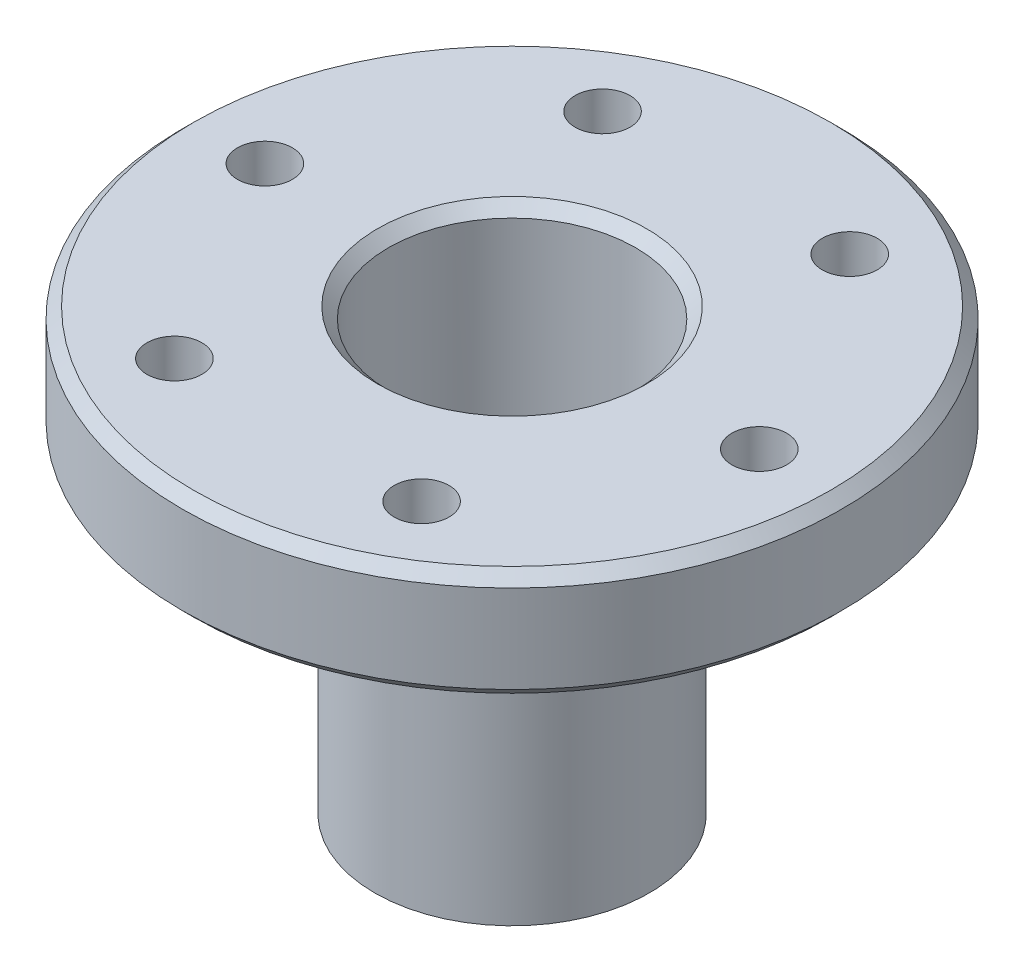
ISO-10303-21;
HEADER;
FILE_DESCRIPTION(('STEP AP214'),'2;1');
FILE_NAME('part.step','',(''),(''),'','','');
FILE_SCHEMA(('AUTOMOTIVE_DESIGN { 1 0 10303 214 1 1 1 1 }'));
ENDSEC;
DATA;
#1=APPLICATION_CONTEXT('core data for automotive mechanical design processes');
#2=APPLICATION_PROTOCOL_DEFINITION('international standard','automotive_design',2000,#1);
#3=PRODUCT_CONTEXT('',#1,'mechanical');
#4=PRODUCT('Part','Part','',(#3));
#5=PRODUCT_RELATED_PRODUCT_CATEGORY('part','',(#4));
#6=PRODUCT_DEFINITION_FORMATION('','',#4);
#7=PRODUCT_DEFINITION_CONTEXT('part definition',#1,'design');
#8=PRODUCT_DEFINITION('design','',#6,#7);
#9=PRODUCT_DEFINITION_SHAPE('','',#8);
#10=(LENGTH_UNIT() NAMED_UNIT(*) SI_UNIT(.MILLI.,.METRE.));
#11=(NAMED_UNIT(*) PLANE_ANGLE_UNIT() SI_UNIT($,.RADIAN.));
#12=(NAMED_UNIT(*) SI_UNIT($,.STERADIAN.) SOLID_ANGLE_UNIT());
#13=UNCERTAINTY_MEASURE_WITH_UNIT(LENGTH_MEASURE(1.E-05),#10,'distance_accuracy_value','');
#14=(GEOMETRIC_REPRESENTATION_CONTEXT(3) GLOBAL_UNCERTAINTY_ASSIGNED_CONTEXT((#13)) GLOBAL_UNIT_ASSIGNED_CONTEXT((#10,
#11,#12)) REPRESENTATION_CONTEXT('',''));
#15=CARTESIAN_POINT('',(0.,0.,0.));
#16=DIRECTION('',(0.,0.,1.));
#17=DIRECTION('',(1.,0.,0.));
#18=AXIS2_PLACEMENT_3D('',#15,#16,#17);
#19=CARTESIAN_POINT('',(0.,20.,0.));
#20=DIRECTION('',(0.,1.,0.));
#21=DIRECTION('',(0.,0.,1.));
#22=AXIS2_PLACEMENT_3D('',#19,#20,#21);
#23=PLANE('',#22);
#24=CARTESIAN_POINT('',(0.,20.,0.));
#25=DIRECTION('',(0.,1.,0.));
#26=DIRECTION('',(0.,0.,1.));
#27=AXIS2_PLACEMENT_3D('',#24,#25,#26);
#28=CIRCLE('',#27,24.5);
#29=CARTESIAN_POINT('',(0.,20.,24.5));
#30=VERTEX_POINT('',#29);
#31=EDGE_CURVE('E64',#30,#30,#28,.F.);
#32=ORIENTED_EDGE('',*,*,#31,.T.);
#33=EDGE_LOOP('',(#32));
#34=FACE_BOUND('',#33,.T.);
#35=CARTESIAN_POINT('',(0.,20.,0.));
#36=DIRECTION('',(0.,1.,0.));
#37=DIRECTION('',(0.,0.,1.));
#38=AXIS2_PLACEMENT_3D('',#35,#36,#37);
#39=CIRCLE('',#38,58.);
#40=CARTESIAN_POINT('',(0.,20.,58.));
#41=VERTEX_POINT('',#40);
#42=EDGE_CURVE('E73',#41,#41,#39,.T.);
#43=ORIENTED_EDGE('',*,*,#42,.T.);
#44=EDGE_LOOP('',(#43));
#45=FACE_BOUND('',#44,.T.);
#46=CARTESIAN_POINT('',(-22.4999999999996,20.,-38.9711431703));
#47=DIRECTION('',(0.,1.,0.));
#48=DIRECTION('',(0.,0.,1.));
#49=AXIS2_PLACEMENT_3D('',#46,#47,#48);
#50=CIRCLE('',#49,4.99999999999999);
#51=CARTESIAN_POINT('',(-22.4999999999996,20.,-33.9711431703));
#52=VERTEX_POINT('',#51);
#53=EDGE_CURVE('E98',#52,#52,#50,.T.);
#54=ORIENTED_EDGE('',*,*,#53,.F.);
#55=EDGE_LOOP('',(#54));
#56=FACE_BOUND('',#55,.T.);
#57=CARTESIAN_POINT('',(-22.5000000000002,20.,38.9711431702996));
#58=DIRECTION('',(0.,1.,0.));
#59=DIRECTION('',(0.,0.,1.));
#60=AXIS2_PLACEMENT_3D('',#57,#58,#59);
#61=CIRCLE('',#60,5.);
#62=CARTESIAN_POINT('',(-22.5000000000002,20.,43.9711431702996));
#63=VERTEX_POINT('',#62);
#64=EDGE_CURVE('E86',#63,#63,#61,.T.);
#65=ORIENTED_EDGE('',*,*,#64,.F.);
#66=EDGE_LOOP('',(#65));
#67=FACE_BOUND('',#66,.T.);
#68=CARTESIAN_POINT('',(45.,20.,0.));
#69=DIRECTION('',(0.,1.,0.));
#70=DIRECTION('',(0.,0.,1.));
#71=AXIS2_PLACEMENT_3D('',#68,#69,#70);
#72=CIRCLE('',#71,5.);
#73=CARTESIAN_POINT('',(45.,20.,5.));
#74=VERTEX_POINT('',#73);
#75=EDGE_CURVE('E76',#74,#74,#72,.T.);
#76=ORIENTED_EDGE('',*,*,#75,.F.);
#77=EDGE_LOOP('',(#76));
#78=FACE_BOUND('',#77,.T.);
#79=CARTESIAN_POINT('',(22.4999999999999,20.,38.9711431702998));
#80=DIRECTION('',(0.,1.,0.));
#81=DIRECTION('',(0.,0.,1.));
#82=AXIS2_PLACEMENT_3D('',#79,#80,#81);
#83=CIRCLE('',#82,5.);
#84=CARTESIAN_POINT('',(22.4999999999999,20.,43.9711431702998));
#85=VERTEX_POINT('',#84);
#86=EDGE_CURVE('E80',#85,#85,#83,.T.);
#87=ORIENTED_EDGE('',*,*,#86,.F.);
#88=EDGE_LOOP('',(#87));
#89=FACE_BOUND('',#88,.T.);
#90=CARTESIAN_POINT('',(-45.,20.,-3.14233320495882E-13));
#91=DIRECTION('',(0.,1.,0.));
#92=DIRECTION('',(0.,0.,1.));
#93=AXIS2_PLACEMENT_3D('',#90,#91,#92);
#94=CIRCLE('',#93,4.99999999999999);
#95=CARTESIAN_POINT('',(-45.,20.,4.99999999999968));
#96=VERTEX_POINT('',#95);
#97=EDGE_CURVE('E92',#96,#96,#94,.T.);
#98=ORIENTED_EDGE('',*,*,#97,.F.);
#99=EDGE_LOOP('',(#98));
#100=FACE_BOUND('',#99,.T.);
#101=CARTESIAN_POINT('',(22.5000000000005,20.,-38.9711431702995));
#102=DIRECTION('',(0.,1.,0.));
#103=DIRECTION('',(0.,0.,1.));
#104=AXIS2_PLACEMENT_3D('',#101,#102,#103);
#105=CIRCLE('',#104,5.);
#106=CARTESIAN_POINT('',(22.5000000000005,20.,-33.9711431702995));
#107=VERTEX_POINT('',#106);
#108=EDGE_CURVE('E104',#107,#107,#105,.T.);
#109=ORIENTED_EDGE('',*,*,#108,.F.);
#110=EDGE_LOOP('',(#109));
#111=FACE_BOUND('',#110,.T.);
#112=ADVANCED_FACE('F37',(#34,#45,#56,#67,#78,#89,#100,#111),#23,.T.);
#113=CARTESIAN_POINT('',(0.,0.,0.));
#114=DIRECTION('',(0.,1.,0.));
#115=DIRECTION('',(0.,0.,1.));
#116=AXIS2_PLACEMENT_3D('',#113,#114,#115);
#117=PLANE('',#116);
#118=CARTESIAN_POINT('',(0.,0.,0.));
#119=DIRECTION('',(0.,1.,0.));
#120=DIRECTION('',(0.,0.,1.));
#121=AXIS2_PLACEMENT_3D('',#118,#119,#120);
#122=CIRCLE('',#121,58.);
#123=CARTESIAN_POINT('',(0.,0.,58.));
#124=VERTEX_POINT('',#123);
#125=EDGE_CURVE('E10',#124,#124,#122,.F.);
#126=ORIENTED_EDGE('',*,*,#125,.T.);
#127=EDGE_LOOP('',(#126));
#128=FACE_BOUND('',#127,.T.);
#129=CARTESIAN_POINT('',(0.,0.,0.));
#130=DIRECTION('',(0.,1.,0.));
#131=DIRECTION('',(0.,0.,1.));
#132=AXIS2_PLACEMENT_3D('',#129,#130,#131);
#133=CIRCLE('',#132,28.);
#134=CARTESIAN_POINT('',(0.,0.,28.));
#135=VERTEX_POINT('',#134);
#136=EDGE_CURVE('E58',#135,#135,#133,.T.);
#137=ORIENTED_EDGE('',*,*,#136,.T.);
#138=EDGE_LOOP('',(#137));
#139=FACE_BOUND('',#138,.T.);
#140=CARTESIAN_POINT('',(45.,0.,0.));
#141=DIRECTION('',(0.,1.,0.));
#142=DIRECTION('',(0.,0.,1.));
#143=AXIS2_PLACEMENT_3D('',#140,#141,#142);
#144=CIRCLE('',#143,5.);
#145=CARTESIAN_POINT('',(45.,0.,5.));
#146=VERTEX_POINT('',#145);
#147=EDGE_CURVE('E77',#146,#146,#144,.T.);
#148=ORIENTED_EDGE('',*,*,#147,.T.);
#149=EDGE_LOOP('',(#148));
#150=FACE_BOUND('',#149,.T.);
#151=CARTESIAN_POINT('',(22.4999999999999,0.,38.9711431702998));
#152=DIRECTION('',(0.,1.,0.));
#153=DIRECTION('',(0.,0.,1.));
#154=AXIS2_PLACEMENT_3D('',#151,#152,#153);
#155=CIRCLE('',#154,5.);
#156=CARTESIAN_POINT('',(22.4999999999999,0.,43.9711431702998));
#157=VERTEX_POINT('',#156);
#158=EDGE_CURVE('E83',#157,#157,#155,.T.);
#159=ORIENTED_EDGE('',*,*,#158,.T.);
#160=EDGE_LOOP('',(#159));
#161=FACE_BOUND('',#160,.T.);
#162=CARTESIAN_POINT('',(-22.5000000000002,0.,38.9711431702996));
#163=DIRECTION('',(0.,1.,0.));
#164=DIRECTION('',(0.,0.,1.));
#165=AXIS2_PLACEMENT_3D('',#162,#163,#164);
#166=CIRCLE('',#165,5.);
#167=CARTESIAN_POINT('',(-22.5000000000002,0.,43.9711431702996));
#168=VERTEX_POINT('',#167);
#169=EDGE_CURVE('E89',#168,#168,#166,.T.);
#170=ORIENTED_EDGE('',*,*,#169,.T.);
#171=EDGE_LOOP('',(#170));
#172=FACE_BOUND('',#171,.T.);
#173=CARTESIAN_POINT('',(-45.,0.,-3.14233320495882E-13));
#174=DIRECTION('',(0.,1.,0.));
#175=DIRECTION('',(0.,0.,1.));
#176=AXIS2_PLACEMENT_3D('',#173,#174,#175);
#177=CIRCLE('',#176,4.99999999999999);
#178=CARTESIAN_POINT('',(-45.,0.,4.99999999999968));
#179=VERTEX_POINT('',#178);
#180=EDGE_CURVE('E95',#179,#179,#177,.T.);
#181=ORIENTED_EDGE('',*,*,#180,.T.);
#182=EDGE_LOOP('',(#181));
#183=FACE_BOUND('',#182,.T.);
#184=CARTESIAN_POINT('',(-22.4999999999996,0.,-38.9711431703));
#185=DIRECTION('',(0.,1.,0.));
#186=DIRECTION('',(0.,0.,1.));
#187=AXIS2_PLACEMENT_3D('',#184,#185,#186);
#188=CIRCLE('',#187,4.99999999999999);
#189=CARTESIAN_POINT('',(-22.4999999999996,0.,-33.9711431703));
#190=VERTEX_POINT('',#189);
#191=EDGE_CURVE('E101',#190,#190,#188,.T.);
#192=ORIENTED_EDGE('',*,*,#191,.T.);
#193=EDGE_LOOP('',(#192));
#194=FACE_BOUND('',#193,.T.);
#195=CARTESIAN_POINT('',(22.5000000000005,0.,-38.9711431702995));
#196=DIRECTION('',(0.,1.,0.));
#197=DIRECTION('',(0.,0.,1.));
#198=AXIS2_PLACEMENT_3D('',#195,#196,#197);
#199=CIRCLE('',#198,5.);
#200=CARTESIAN_POINT('',(22.5000000000005,0.,-33.9711431702995));
#201=VERTEX_POINT('',#200);
#202=EDGE_CURVE('E107',#201,#201,#199,.T.);
#203=ORIENTED_EDGE('',*,*,#202,.T.);
#204=EDGE_LOOP('',(#203));
#205=FACE_BOUND('',#204,.T.);
#206=ADVANCED_FACE('F135',(#128,#139,#150,#161,#172,#183,#194,#205),#117,.F.);
#207=CARTESIAN_POINT('',(0.,20.,0.));
#208=DIRECTION('',(0.,-1.,0.));
#209=DIRECTION('',(0.,0.,-1.));
#210=AXIS2_PLACEMENT_3D('',#207,#208,#209);
#211=CYLINDRICAL_SURFACE('',#210,60.);
#212=CARTESIAN_POINT('',(0.,1.99999999999997,0.));
#213=DIRECTION('',(0.,1.,0.));
#214=DIRECTION('',(0.,0.,1.));
#215=AXIS2_PLACEMENT_3D('',#212,#213,#214);
#216=CIRCLE('',#215,60.);
#217=CARTESIAN_POINT('',(0.,1.99999999999997,60.));
#218=VERTEX_POINT('',#217);
#219=EDGE_CURVE('E45',#218,#218,#216,.T.);
#220=ORIENTED_EDGE('',*,*,#219,.T.);
#221=EDGE_LOOP('',(#220));
#222=FACE_BOUND('',#221,.T.);
#223=CARTESIAN_POINT('',(0.,18.,0.));
#224=DIRECTION('',(0.,1.,0.));
#225=DIRECTION('',(0.,0.,1.));
#226=AXIS2_PLACEMENT_3D('',#223,#224,#225);
#227=CIRCLE('',#226,60.);
#228=CARTESIAN_POINT('',(0.,18.,60.));
#229=VERTEX_POINT('',#228);
#230=EDGE_CURVE('E70',#229,#229,#227,.F.);
#231=ORIENTED_EDGE('',*,*,#230,.T.);
#232=EDGE_LOOP('',(#231));
#233=FACE_BOUND('',#232,.T.);
#234=ADVANCED_FACE('F141',(#222,#233),#211,.T.);
#235=CARTESIAN_POINT('',(0.,20.,0.));
#236=DIRECTION('',(0.,-1.,0.));
#237=DIRECTION('',(0.,0.,-1.));
#238=AXIS2_PLACEMENT_3D('',#235,#236,#237);
#239=CYLINDRICAL_SURFACE('',#238,22.5);
#240=CARTESIAN_POINT('',(0.,-58.,0.));
#241=DIRECTION('',(0.,-1.,0.));
#242=DIRECTION('',(0.,0.,-1.));
#243=AXIS2_PLACEMENT_3D('',#240,#241,#242);
#244=CIRCLE('',#243,22.5);
#245=CARTESIAN_POINT('',(0.,-58.,-22.5));
#246=VERTEX_POINT('',#245);
#247=EDGE_CURVE('E49',#246,#246,#244,.T.);
#248=ORIENTED_EDGE('',*,*,#247,.T.);
#249=EDGE_LOOP('',(#248));
#250=FACE_BOUND('',#249,.T.);
#251=CARTESIAN_POINT('',(0.,18.,0.));
#252=DIRECTION('',(0.,1.,0.));
#253=DIRECTION('',(0.,0.,1.));
#254=AXIS2_PLACEMENT_3D('',#251,#252,#253);
#255=CIRCLE('',#254,22.5);
#256=CARTESIAN_POINT('',(0.,18.,22.5));
#257=VERTEX_POINT('',#256);
#258=EDGE_CURVE('E67',#257,#257,#255,.T.);
#259=ORIENTED_EDGE('',*,*,#258,.T.);
#260=EDGE_LOOP('',(#259));
#261=FACE_BOUND('',#260,.T.);
#262=ADVANCED_FACE('F145',(#250,#261),#239,.F.);
#263=CARTESIAN_POINT('',(45.,20.,0.));
#264=DIRECTION('',(0.,-1.,0.));
#265=DIRECTION('',(0.,0.,-1.));
#266=AXIS2_PLACEMENT_3D('',#263,#264,#265);
#267=CYLINDRICAL_SURFACE('',#266,5.);
#268=ORIENTED_EDGE('',*,*,#75,.T.);
#269=EDGE_LOOP('',(#268));
#270=FACE_BOUND('',#269,.T.);
#271=ORIENTED_EDGE('',*,*,#147,.F.);
#272=EDGE_LOOP('',(#271));
#273=FACE_BOUND('',#272,.T.);
#274=ADVANCED_FACE('F178',(#270,#273),#267,.F.);
#275=CARTESIAN_POINT('',(22.4999999999999,20.,38.9711431702998));
#276=DIRECTION('',(0.,-1.,0.));
#277=DIRECTION('',(0.,0.,-1.));
#278=AXIS2_PLACEMENT_3D('',#275,#276,#277);
#279=CYLINDRICAL_SURFACE('',#278,5.);
#280=ORIENTED_EDGE('',*,*,#86,.T.);
#281=EDGE_LOOP('',(#280));
#282=FACE_BOUND('',#281,.T.);
#283=ORIENTED_EDGE('',*,*,#158,.F.);
#284=EDGE_LOOP('',(#283));
#285=FACE_BOUND('',#284,.T.);
#286=ADVANCED_FACE('F184',(#282,#285),#279,.F.);
#287=CARTESIAN_POINT('',(-22.5000000000002,20.,38.9711431702996));
#288=DIRECTION('',(0.,-1.,0.));
#289=DIRECTION('',(0.,0.,-1.));
#290=AXIS2_PLACEMENT_3D('',#287,#288,#289);
#291=CYLINDRICAL_SURFACE('',#290,5.);
#292=ORIENTED_EDGE('',*,*,#64,.T.);
#293=EDGE_LOOP('',(#292));
#294=FACE_BOUND('',#293,.T.);
#295=ORIENTED_EDGE('',*,*,#169,.F.);
#296=EDGE_LOOP('',(#295));
#297=FACE_BOUND('',#296,.T.);
#298=ADVANCED_FACE('F189',(#294,#297),#291,.F.);
#299=CARTESIAN_POINT('',(-45.,20.,-3.14233320495882E-13));
#300=DIRECTION('',(0.,-1.,0.));
#301=DIRECTION('',(0.,0.,-1.));
#302=AXIS2_PLACEMENT_3D('',#299,#300,#301);
#303=CYLINDRICAL_SURFACE('',#302,4.99999999999999);
#304=ORIENTED_EDGE('',*,*,#97,.T.);
#305=EDGE_LOOP('',(#304));
#306=FACE_BOUND('',#305,.T.);
#307=ORIENTED_EDGE('',*,*,#180,.F.);
#308=EDGE_LOOP('',(#307));
#309=FACE_BOUND('',#308,.T.);
#310=ADVANCED_FACE('F196',(#306,#309),#303,.F.);
#311=CARTESIAN_POINT('',(-22.4999999999996,20.,-38.9711431703));
#312=DIRECTION('',(0.,-1.,0.));
#313=DIRECTION('',(0.,0.,-1.));
#314=AXIS2_PLACEMENT_3D('',#311,#312,#313);
#315=CYLINDRICAL_SURFACE('',#314,4.99999999999999);
#316=ORIENTED_EDGE('',*,*,#53,.T.);
#317=EDGE_LOOP('',(#316));
#318=FACE_BOUND('',#317,.T.);
#319=ORIENTED_EDGE('',*,*,#191,.F.);
#320=EDGE_LOOP('',(#319));
#321=FACE_BOUND('',#320,.T.);
#322=ADVANCED_FACE('F200',(#318,#321),#315,.F.);
#323=CARTESIAN_POINT('',(22.5000000000005,20.,-38.9711431702995));
#324=DIRECTION('',(0.,-1.,0.));
#325=DIRECTION('',(0.,0.,-1.));
#326=AXIS2_PLACEMENT_3D('',#323,#324,#325);
#327=CYLINDRICAL_SURFACE('',#326,5.);
#328=ORIENTED_EDGE('',*,*,#108,.T.);
#329=EDGE_LOOP('',(#328));
#330=FACE_BOUND('',#329,.T.);
#331=ORIENTED_EDGE('',*,*,#202,.F.);
#332=EDGE_LOOP('',(#331));
#333=FACE_BOUND('',#332,.T.);
#334=ADVANCED_FACE('F155',(#330,#333),#327,.F.);
#335=CARTESIAN_POINT('',(0.,20.,0.));
#336=DIRECTION('',(0.,-1.,0.));
#337=DIRECTION('',(0.,0.,-1.));
#338=AXIS2_PLACEMENT_3D('',#335,#336,#337);
#339=CONICAL_SURFACE('',#338,58.,0.785398163397454);
#340=ORIENTED_EDGE('',*,*,#230,.F.);
#341=EDGE_LOOP('',(#340));
#342=FACE_BOUND('',#341,.T.);
#343=ORIENTED_EDGE('',*,*,#42,.F.);
#344=EDGE_LOOP('',(#343));
#345=FACE_BOUND('',#344,.T.);
#346=ADVANCED_FACE('F130',(#342,#345),#339,.T.);
#347=CARTESIAN_POINT('',(0.,18.,0.));
#348=DIRECTION('',(0.,1.,0.));
#349=DIRECTION('',(0.,0.,1.));
#350=AXIS2_PLACEMENT_3D('',#347,#348,#349);
#351=CONICAL_SURFACE('',#350,22.5,0.785398163397452);
#352=ORIENTED_EDGE('',*,*,#31,.F.);
#353=EDGE_LOOP('',(#352));
#354=FACE_BOUND('',#353,.T.);
#355=ORIENTED_EDGE('',*,*,#258,.F.);
#356=EDGE_LOOP('',(#355));
#357=FACE_BOUND('',#356,.T.);
#358=ADVANCED_FACE('F120',(#354,#357),#351,.F.);
#359=CARTESIAN_POINT('',(0.,-60.,0.));
#360=DIRECTION('',(0.,1.,0.));
#361=DIRECTION('',(0.,0.,1.));
#362=AXIS2_PLACEMENT_3D('',#359,#360,#361);
#363=CYLINDRICAL_SURFACE('',#362,25.);
#364=CARTESIAN_POINT('',(0.,-3.,0.));
#365=DIRECTION('',(0.,1.,0.));
#366=DIRECTION('',(0.,0.,1.));
#367=AXIS2_PLACEMENT_3D('',#364,#365,#366);
#368=CIRCLE('',#367,25.);
#369=CARTESIAN_POINT('',(0.,-3.,25.));
#370=VERTEX_POINT('',#369);
#371=EDGE_CURVE('E61',#370,#370,#368,.F.);
#372=ORIENTED_EDGE('',*,*,#371,.T.);
#373=EDGE_LOOP('',(#372));
#374=FACE_BOUND('',#373,.T.);
#375=CARTESIAN_POINT('',(0.,-60.,0.));
#376=DIRECTION('',(0.,-1.,0.));
#377=DIRECTION('',(0.,0.,-1.));
#378=AXIS2_PLACEMENT_3D('',#375,#376,#377);
#379=CIRCLE('',#378,25.);
#380=CARTESIAN_POINT('',(0.,-60.,-25.));
#381=VERTEX_POINT('',#380);
#382=EDGE_CURVE('E110',#381,#381,#379,.T.);
#383=ORIENTED_EDGE('',*,*,#382,.F.);
#384=EDGE_LOOP('',(#383));
#385=FACE_BOUND('',#384,.T.);
#386=ADVANCED_FACE('F118',(#374,#385),#363,.T.);
#387=CARTESIAN_POINT('',(0.,-60.,0.));
#388=DIRECTION('',(0.,-1.,0.));
#389=DIRECTION('',(0.,0.,-1.));
#390=AXIS2_PLACEMENT_3D('',#387,#388,#389);
#391=PLANE('',#390);
#392=CARTESIAN_POINT('',(0.,-60.,0.));
#393=DIRECTION('',(0.,-1.,0.));
#394=DIRECTION('',(0.,0.,-1.));
#395=AXIS2_PLACEMENT_3D('',#392,#393,#394);
#396=CIRCLE('',#395,24.5);
#397=CARTESIAN_POINT('',(0.,-60.,-24.5));
#398=VERTEX_POINT('',#397);
#399=EDGE_CURVE('E53',#398,#398,#396,.F.);
#400=ORIENTED_EDGE('',*,*,#399,.T.);
#401=EDGE_LOOP('',(#400));
#402=FACE_BOUND('',#401,.T.);
#403=ORIENTED_EDGE('',*,*,#382,.T.);
#404=EDGE_LOOP('',(#403));
#405=FACE_BOUND('',#404,.T.);
#406=ADVANCED_FACE('F116',(#402,#405),#391,.T.);
#407=CARTESIAN_POINT('',(0.,-3.,0.));
#408=DIRECTION('',(0.,1.,0.));
#409=DIRECTION('',(0.,0.,1.));
#410=AXIS2_PLACEMENT_3D('',#407,#408,#409);
#411=TOROIDAL_SURFACE('',#410,28.,3.);
#412=ORIENTED_EDGE('',*,*,#136,.F.);
#413=EDGE_LOOP('',(#412));
#414=FACE_BOUND('',#413,.T.);
#415=ORIENTED_EDGE('',*,*,#371,.F.);
#416=EDGE_LOOP('',(#415));
#417=FACE_BOUND('',#416,.T.);
#418=ADVANCED_FACE('F127',(#414,#417),#411,.F.);
#419=CARTESIAN_POINT('',(0.,-60.,0.));
#420=DIRECTION('',(0.,-1.,0.));
#421=DIRECTION('',(0.,0.,-1.));
#422=AXIS2_PLACEMENT_3D('',#419,#420,#421);
#423=CONICAL_SURFACE('',#422,24.5,0.785398163397442);
#424=ORIENTED_EDGE('',*,*,#247,.F.);
#425=EDGE_LOOP('',(#424));
#426=FACE_BOUND('',#425,.T.);
#427=ORIENTED_EDGE('',*,*,#399,.F.);
#428=EDGE_LOOP('',(#427));
#429=FACE_BOUND('',#428,.T.);
#430=ADVANCED_FACE('F162',(#426,#429),#423,.F.);
#431=CARTESIAN_POINT('',(0.,1.99999999999997,0.));
#432=DIRECTION('',(0.,1.,0.));
#433=DIRECTION('',(0.,0.,1.));
#434=AXIS2_PLACEMENT_3D('',#431,#432,#433);
#435=CONICAL_SURFACE('',#434,60.,0.785398163397445);
#436=ORIENTED_EDGE('',*,*,#125,.F.);
#437=EDGE_LOOP('',(#436));
#438=FACE_BOUND('',#437,.T.);
#439=ORIENTED_EDGE('',*,*,#219,.F.);
#440=EDGE_LOOP('',(#439));
#441=FACE_BOUND('',#440,.T.);
#442=ADVANCED_FACE('F40',(#438,#441),#435,.T.);
#443=CLOSED_SHELL('',(#112,#206,#234,#262,#274,#286,#298,#310,#322,#334,#346,#358,#386,#406,
#418,#430,#442));
#444=MANIFOLD_SOLID_BREP('B2',#443);
#445=ADVANCED_BREP_SHAPE_REPRESENTATION('',(#18,#444),#14);
#446=SHAPE_DEFINITION_REPRESENTATION(#9,#445);
ENDSEC;
END-ISO-10303-21;
